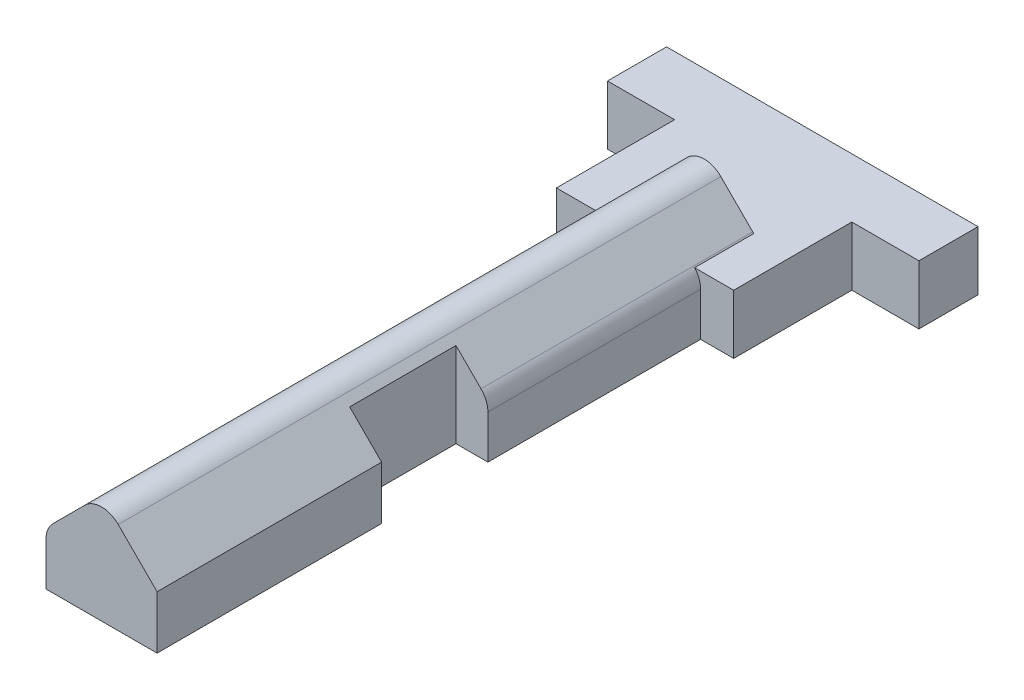
ISO-10303-21;
HEADER;
FILE_DESCRIPTION(('STEP AP214'),'2;1');
FILE_NAME('part.step','',(''),(''),'','','');
FILE_SCHEMA(('AUTOMOTIVE_DESIGN { 1 0 10303 214 1 1 1 1 }'));
ENDSEC;
DATA;
#1=APPLICATION_CONTEXT('core data for automotive mechanical design processes');
#2=APPLICATION_PROTOCOL_DEFINITION('international standard','automotive_design',2000,#1);
#3=PRODUCT_CONTEXT('',#1,'mechanical');
#4=PRODUCT('Part','Part','',(#3));
#5=PRODUCT_RELATED_PRODUCT_CATEGORY('part','',(#4));
#6=PRODUCT_DEFINITION_FORMATION('','',#4);
#7=PRODUCT_DEFINITION_CONTEXT('part definition',#1,'design');
#8=PRODUCT_DEFINITION('design','',#6,#7);
#9=PRODUCT_DEFINITION_SHAPE('','',#8);
#10=(LENGTH_UNIT() NAMED_UNIT(*) SI_UNIT(.MILLI.,.METRE.));
#11=(NAMED_UNIT(*) PLANE_ANGLE_UNIT() SI_UNIT($,.RADIAN.));
#12=(NAMED_UNIT(*) SI_UNIT($,.STERADIAN.) SOLID_ANGLE_UNIT());
#13=UNCERTAINTY_MEASURE_WITH_UNIT(LENGTH_MEASURE(1.E-05),#10,'distance_accuracy_value','');
#14=(GEOMETRIC_REPRESENTATION_CONTEXT(3) GLOBAL_UNCERTAINTY_ASSIGNED_CONTEXT((#13)) GLOBAL_UNIT_ASSIGNED_CONTEXT((#10,
#11,#12)) REPRESENTATION_CONTEXT('',''));
#15=CARTESIAN_POINT('',(0.,0.,0.));
#16=DIRECTION('',(0.,0.,1.));
#17=DIRECTION('',(1.,0.,0.));
#18=AXIS2_PLACEMENT_3D('',#15,#16,#17);
#19=CARTESIAN_POINT('',(0.,0.,0.));
#20=DIRECTION('',(0.,0.,1.));
#21=DIRECTION('',(1.,0.,0.));
#22=AXIS2_PLACEMENT_3D('',#19,#20,#21);
#23=PLANE('',#22);
#24=DIRECTION('',(0.707106781186546,-0.707106781186549,0.));
#25=VECTOR('',#24,1.);
#26=CARTESIAN_POINT('',(3.47500000000001,3.475,0.));
#27=LINE('',#26,#25);
#28=CARTESIAN_POINT('',(1.4142135623731,5.53578643762692,0.));
#29=VERTEX_POINT('',#28);
#30=CARTESIAN_POINT('',(4.1142135623731,2.83578643762691,0.));
#31=VERTEX_POINT('',#30);
#32=EDGE_CURVE('E331',#29,#31,#27,.T.);
#33=ORIENTED_EDGE('',*,*,#32,.T.);
#34=CARTESIAN_POINT('',(2.7,1.42157287525381,0.));
#35=DIRECTION('',(0.,0.,1.));
#36=DIRECTION('',(1.,0.,0.));
#37=AXIS2_PLACEMENT_3D('',#34,#35,#36);
#38=CIRCLE('',#37,2.);
#39=CARTESIAN_POINT('',(4.19508574143378,2.75,0.));
#40=VERTEX_POINT('',#39);
#41=EDGE_CURVE('E378',#31,#40,#38,.F.);
#42=ORIENTED_EDGE('',*,*,#41,.T.);
#43=DIRECTION('',(1.,0.,0.));
#44=VECTOR('',#43,1.);
#45=CARTESIAN_POINT('',(0.,2.75,0.));
#46=LINE('',#45,#44);
#47=CARTESIAN_POINT('',(-4.19508574143377,2.75,0.));
#48=VERTEX_POINT('',#47);
#49=EDGE_CURVE('E365',#48,#40,#46,.T.);
#50=ORIENTED_EDGE('',*,*,#49,.F.);
#51=CARTESIAN_POINT('',(-2.7,1.42157287525381,0.));
#52=DIRECTION('',(0.,0.,1.));
#53=DIRECTION('',(1.,0.,0.));
#54=AXIS2_PLACEMENT_3D('',#51,#52,#53);
#55=CIRCLE('',#54,2.);
#56=CARTESIAN_POINT('',(-4.1142135623731,2.83578643762691,0.));
#57=VERTEX_POINT('',#56);
#58=EDGE_CURVE('E376',#48,#57,#55,.F.);
#59=ORIENTED_EDGE('',*,*,#58,.T.);
#60=DIRECTION('',(0.707106781186546,0.707106781186549,0.));
#61=VECTOR('',#60,1.);
#62=CARTESIAN_POINT('',(-3.47500000000001,3.475,0.));
#63=LINE('',#62,#61);
#64=CARTESIAN_POINT('',(-1.4142135623731,5.53578643762692,0.));
#65=VERTEX_POINT('',#64);
#66=EDGE_CURVE('E335',#57,#65,#63,.T.);
#67=ORIENTED_EDGE('',*,*,#66,.T.);
#68=CARTESIAN_POINT('',(0.,4.12157287525382,0.));
#69=DIRECTION('',(0.,0.,1.));
#70=DIRECTION('',(1.,0.,0.));
#71=AXIS2_PLACEMENT_3D('',#68,#69,#70);
#72=CIRCLE('',#71,2.);
#73=EDGE_CURVE('E374',#65,#29,#72,.F.);
#74=ORIENTED_EDGE('',*,*,#73,.T.);
#75=EDGE_LOOP('',(#33,#42,#50,#59,#67,#74));
#76=FACE_BOUND('',#75,.T.);
#77=ADVANCED_FACE('F89',(#76),#23,.F.);
#78=CARTESIAN_POINT('',(3.47500000000001,3.475,51.));
#79=DIRECTION('',(0.707106781186549,0.707106781186546,0.));
#80=DIRECTION('',(-0.707106781186546,0.707106781186549,0.));
#81=AXIS2_PLACEMENT_3D('',#78,#79,#80);
#82=PLANE('',#81);
#83=DIRECTION('',(-0.707106781186546,0.707106781186549,0.));
#84=VECTOR('',#83,1.);
#85=CARTESIAN_POINT('',(3.47500000000001,3.475,23.));
#86=LINE('',#85,#84);
#87=CARTESIAN_POINT('',(4.1142135623731,2.83578643762691,23.));
#88=VERTEX_POINT('',#87);
#89=CARTESIAN_POINT('',(2.,4.95000000000001,23.));
#90=VERTEX_POINT('',#89);
#91=EDGE_CURVE('E323',#88,#90,#86,.T.);
#92=ORIENTED_EDGE('',*,*,#91,.F.);
#93=DIRECTION('',(0.,0.,-1.));
#94=VECTOR('',#93,1.);
#95=CARTESIAN_POINT('',(4.1142135623731,2.83578643762691,51.));
#96=LINE('',#95,#94);
#97=EDGE_CURVE('E371',#88,#31,#96,.T.);
#98=ORIENTED_EDGE('',*,*,#97,.T.);
#99=ORIENTED_EDGE('',*,*,#32,.F.);
#100=DIRECTION('',(0.,0.,-1.));
#101=VECTOR('',#100,1.);
#102=CARTESIAN_POINT('',(1.4142135623731,5.53578643762692,51.));
#103=LINE('',#102,#101);
#104=CARTESIAN_POINT('',(1.4142135623731,5.53578643762692,51.));
#105=VERTEX_POINT('',#104);
#106=EDGE_CURVE('E369',#29,#105,#103,.F.);
#107=ORIENTED_EDGE('',*,*,#106,.T.);
#108=DIRECTION('',(0.707106781186546,-0.707106781186549,0.));
#109=VECTOR('',#108,1.);
#110=CARTESIAN_POINT('',(3.47500000000001,3.475,51.));
#111=LINE('',#110,#109);
#112=CARTESIAN_POINT('',(4.7,2.25,51.));
#113=VERTEX_POINT('',#112);
#114=EDGE_CURVE('E332',#105,#113,#111,.T.);
#115=ORIENTED_EDGE('',*,*,#114,.T.);
#116=DIRECTION('',(0.,0.,-1.));
#117=VECTOR('',#116,1.);
#118=CARTESIAN_POINT('',(4.7,2.25,51.));
#119=LINE('',#118,#117);
#120=CARTESIAN_POINT('',(4.7,2.25,32.));
#121=VERTEX_POINT('',#120);
#122=EDGE_CURVE('E345',#113,#121,#119,.T.);
#123=ORIENTED_EDGE('',*,*,#122,.T.);
#124=DIRECTION('',(-0.707106781186546,0.707106781186549,0.));
#125=VECTOR('',#124,1.);
#126=CARTESIAN_POINT('',(3.47500000000001,3.475,32.));
#127=LINE('',#126,#125);
#128=CARTESIAN_POINT('',(2.,4.95000000000001,32.));
#129=VERTEX_POINT('',#128);
#130=EDGE_CURVE('E326',#121,#129,#127,.T.);
#131=ORIENTED_EDGE('',*,*,#130,.T.);
#132=DIRECTION('',(0.,0.,1.));
#133=VECTOR('',#132,1.);
#134=CARTESIAN_POINT('',(2.,4.95000000000001,51.));
#135=LINE('',#134,#133);
#136=EDGE_CURVE('E329',#90,#129,#135,.T.);
#137=ORIENTED_EDGE('',*,*,#136,.F.);
#138=EDGE_LOOP('',(#92,#98,#99,#107,#115,#123,#131,#137));
#139=FACE_BOUND('',#138,.T.);
#140=ADVANCED_FACE('F422',(#139),#82,.T.);
#141=CARTESIAN_POINT('',(0.,-2.25,51.));
#142=DIRECTION('',(0.,1.,0.));
#143=DIRECTION('',(-1.,0.,0.));
#144=AXIS2_PLACEMENT_3D('',#141,#142,#143);
#145=PLANE('',#144);
#146=DIRECTION('',(0.,0.,-1.));
#147=VECTOR('',#146,1.);
#148=CARTESIAN_POINT('',(-4.7,-2.25,51.));
#149=LINE('',#148,#147);
#150=CARTESIAN_POINT('',(-4.7,-2.25,51.));
#151=VERTEX_POINT('',#150);
#152=CARTESIAN_POINT('',(-4.7,-2.25,5.));
#153=VERTEX_POINT('',#152);
#154=EDGE_CURVE('E356',#151,#153,#149,.T.);
#155=ORIENTED_EDGE('',*,*,#154,.T.);
#156=DIRECTION('',(-1.,0.,0.));
#157=VECTOR('',#156,1.);
#158=CARTESIAN_POINT('',(0.,-2.25,5.));
#159=LINE('',#158,#157);
#160=CARTESIAN_POINT('',(-7.5,-2.25,5.));
#161=VERTEX_POINT('',#160);
#162=EDGE_CURVE('E290',#153,#161,#159,.T.);
#163=ORIENTED_EDGE('',*,*,#162,.T.);
#164=DIRECTION('',(0.,0.,1.));
#165=VECTOR('',#164,1.);
#166=CARTESIAN_POINT('',(-7.5,-2.25,0.));
#167=LINE('',#166,#165);
#168=CARTESIAN_POINT('',(-7.5,-2.25,-5.));
#169=VERTEX_POINT('',#168);
#170=EDGE_CURVE('E266',#169,#161,#167,.T.);
#171=ORIENTED_EDGE('',*,*,#170,.F.);
#172=DIRECTION('',(-1.,0.,0.));
#173=VECTOR('',#172,1.);
#174=CARTESIAN_POINT('',(0.,-2.25,-5.));
#175=LINE('',#174,#173);
#176=CARTESIAN_POINT('',(-13.1781166472828,-2.25,-5.));
#177=VERTEX_POINT('',#176);
#178=EDGE_CURVE('E263',#169,#177,#175,.T.);
#179=ORIENTED_EDGE('',*,*,#178,.T.);
#180=DIRECTION('',(0.,0.,1.));
#181=VECTOR('',#180,1.);
#182=CARTESIAN_POINT('',(-13.1781166472828,-2.25,0.));
#183=LINE('',#182,#181);
#184=CARTESIAN_POINT('',(-13.1781166472828,-2.25,-10.));
#185=VERTEX_POINT('',#184);
#186=EDGE_CURVE('E280',#185,#177,#183,.T.);
#187=ORIENTED_EDGE('',*,*,#186,.F.);
#188=DIRECTION('',(-1.,0.,0.));
#189=VECTOR('',#188,1.);
#190=CARTESIAN_POINT('',(0.,-2.25,-10.));
#191=LINE('',#190,#189);
#192=CARTESIAN_POINT('',(13.1781166472828,-2.25,-10.));
#193=VERTEX_POINT('',#192);
#194=EDGE_CURVE('E253',#193,#185,#191,.T.);
#195=ORIENTED_EDGE('',*,*,#194,.F.);
#196=DIRECTION('',(0.,0.,1.));
#197=VECTOR('',#196,1.);
#198=CARTESIAN_POINT('',(13.1781166472828,-2.25,0.));
#199=LINE('',#198,#197);
#200=CARTESIAN_POINT('',(13.1781166472828,-2.25,-5.));
#201=VERTEX_POINT('',#200);
#202=EDGE_CURVE('E283',#193,#201,#199,.T.);
#203=ORIENTED_EDGE('',*,*,#202,.T.);
#204=CARTESIAN_POINT('',(7.5,-2.25,-5.));
#205=VERTEX_POINT('',#204);
#206=EDGE_CURVE('E268',#201,#205,#175,.T.);
#207=ORIENTED_EDGE('',*,*,#206,.T.);
#208=DIRECTION('',(0.,0.,1.));
#209=VECTOR('',#208,1.);
#210=CARTESIAN_POINT('',(7.5,-2.25,0.));
#211=LINE('',#210,#209);
#212=CARTESIAN_POINT('',(7.5,-2.25,5.));
#213=VERTEX_POINT('',#212);
#214=EDGE_CURVE('E287',#205,#213,#211,.T.);
#215=ORIENTED_EDGE('',*,*,#214,.T.);
#216=CARTESIAN_POINT('',(4.7,-2.25,5.));
#217=VERTEX_POINT('',#216);
#218=EDGE_CURVE('E291',#213,#217,#159,.T.);
#219=ORIENTED_EDGE('',*,*,#218,.T.);
#220=DIRECTION('',(0.,0.,-1.));
#221=VECTOR('',#220,1.);
#222=CARTESIAN_POINT('',(4.7,-2.25,51.));
#223=LINE('',#222,#221);
#224=CARTESIAN_POINT('',(4.7,-2.25,23.));
#225=VERTEX_POINT('',#224);
#226=EDGE_CURVE('E352',#225,#217,#223,.T.);
#227=ORIENTED_EDGE('',*,*,#226,.F.);
#228=DIRECTION('',(1.,0.,0.));
#229=VECTOR('',#228,1.);
#230=CARTESIAN_POINT('',(0.,-2.25,23.));
#231=LINE('',#230,#229);
#232=CARTESIAN_POINT('',(2.,-2.25,23.));
#233=VERTEX_POINT('',#232);
#234=EDGE_CURVE('E318',#233,#225,#231,.T.);
#235=ORIENTED_EDGE('',*,*,#234,.F.);
#236=DIRECTION('',(0.,0.,-1.));
#237=VECTOR('',#236,1.);
#238=CARTESIAN_POINT('',(2.,-2.25,0.));
#239=LINE('',#238,#237);
#240=CARTESIAN_POINT('',(2.,-2.25,32.));
#241=VERTEX_POINT('',#240);
#242=EDGE_CURVE('E315',#241,#233,#239,.T.);
#243=ORIENTED_EDGE('',*,*,#242,.F.);
#244=DIRECTION('',(1.,0.,0.));
#245=VECTOR('',#244,1.);
#246=CARTESIAN_POINT('',(0.,-2.25,32.));
#247=LINE('',#246,#245);
#248=CARTESIAN_POINT('',(4.7,-2.25,32.));
#249=VERTEX_POINT('',#248);
#250=EDGE_CURVE('E312',#241,#249,#247,.T.);
#251=ORIENTED_EDGE('',*,*,#250,.T.);
#252=CARTESIAN_POINT('',(4.7,-2.25,51.));
#253=VERTEX_POINT('',#252);
#254=EDGE_CURVE('E353',#253,#249,#223,.T.);
#255=ORIENTED_EDGE('',*,*,#254,.F.);
#256=DIRECTION('',(1.,0.,0.));
#257=VECTOR('',#256,1.);
#258=CARTESIAN_POINT('',(0.,-2.25,51.));
#259=LINE('',#258,#257);
#260=EDGE_CURVE('E340',#151,#253,#259,.T.);
#261=ORIENTED_EDGE('',*,*,#260,.F.);
#262=EDGE_LOOP('',(#155,#163,#171,#179,#187,#195,#203,#207,#215,#219,#227,#235,#243,#251,#255,#261));
#263=FACE_BOUND('',#262,.T.);
#264=ADVANCED_FACE('F436',(#263),#145,.F.);
#265=CARTESIAN_POINT('',(4.7,0.,51.));
#266=DIRECTION('',(1.,0.,0.));
#267=DIRECTION('',(0.,0.,-1.));
#268=AXIS2_PLACEMENT_3D('',#265,#266,#267);
#269=PLANE('',#268);
#270=ORIENTED_EDGE('',*,*,#254,.T.);
#271=DIRECTION('',(0.,1.,0.));
#272=VECTOR('',#271,1.);
#273=CARTESIAN_POINT('',(4.7,0.,32.));
#274=LINE('',#273,#272);
#275=EDGE_CURVE('E362',#249,#121,#274,.T.);
#276=ORIENTED_EDGE('',*,*,#275,.T.);
#277=ORIENTED_EDGE('',*,*,#122,.F.);
#278=DIRECTION('',(0.,-1.,0.));
#279=VECTOR('',#278,1.);
#280=CARTESIAN_POINT('',(4.7,0.,51.));
#281=LINE('',#280,#279);
#282=EDGE_CURVE('E342',#113,#253,#281,.T.);
#283=ORIENTED_EDGE('',*,*,#282,.T.);
#284=EDGE_LOOP('',(#270,#276,#277,#283));
#285=FACE_BOUND('',#284,.T.);
#286=ADVANCED_FACE('F480',(#285),#269,.T.);
#287=CARTESIAN_POINT('',(-3.47500000000001,3.475,51.));
#288=DIRECTION('',(-0.707106781186549,0.707106781186546,0.));
#289=DIRECTION('',(-0.707106781186546,-0.707106781186549,0.));
#290=AXIS2_PLACEMENT_3D('',#287,#288,#289);
#291=PLANE('',#290);
#292=ORIENTED_EDGE('',*,*,#66,.F.);
#293=DIRECTION('',(0.,0.,-1.));
#294=VECTOR('',#293,1.);
#295=CARTESIAN_POINT('',(-4.1142135623731,2.83578643762691,51.));
#296=LINE('',#295,#294);
#297=CARTESIAN_POINT('',(-4.1142135623731,2.83578643762691,51.));
#298=VERTEX_POINT('',#297);
#299=EDGE_CURVE('E390',#57,#298,#296,.F.);
#300=ORIENTED_EDGE('',*,*,#299,.T.);
#301=DIRECTION('',(0.707106781186546,0.707106781186549,0.));
#302=VECTOR('',#301,1.);
#303=CARTESIAN_POINT('',(-3.47500000000001,3.475,51.));
#304=LINE('',#303,#302);
#305=CARTESIAN_POINT('',(-1.4142135623731,5.53578643762692,51.));
#306=VERTEX_POINT('',#305);
#307=EDGE_CURVE('E334',#298,#306,#304,.T.);
#308=ORIENTED_EDGE('',*,*,#307,.T.);
#309=DIRECTION('',(0.,0.,-1.));
#310=VECTOR('',#309,1.);
#311=CARTESIAN_POINT('',(-1.4142135623731,5.53578643762692,51.));
#312=LINE('',#311,#310);
#313=EDGE_CURVE('E387',#306,#65,#312,.T.);
#314=ORIENTED_EDGE('',*,*,#313,.T.);
#315=EDGE_LOOP('',(#292,#300,#308,#314));
#316=FACE_BOUND('',#315,.T.);
#317=ADVANCED_FACE('F475',(#316),#291,.T.);
#318=CARTESIAN_POINT('',(-4.7,0.,51.));
#319=DIRECTION('',(1.,0.,0.));
#320=DIRECTION('',(0.,0.,-1.));
#321=AXIS2_PLACEMENT_3D('',#318,#319,#320);
#322=PLANE('',#321);
#323=DIRECTION('',(0.,-1.,0.));
#324=VECTOR('',#323,1.);
#325=CARTESIAN_POINT('',(-4.7,0.,51.));
#326=LINE('',#325,#324);
#327=CARTESIAN_POINT('',(-4.7,1.42157287525381,51.));
#328=VERTEX_POINT('',#327);
#329=EDGE_CURVE('E338',#328,#151,#326,.T.);
#330=ORIENTED_EDGE('',*,*,#329,.F.);
#331=DIRECTION('',(0.,0.,-1.));
#332=VECTOR('',#331,1.);
#333=CARTESIAN_POINT('',(-4.7,1.42157287525381,5.));
#334=LINE('',#333,#332);
#335=CARTESIAN_POINT('',(-4.7,1.42157287525381,5.));
#336=VERTEX_POINT('',#335);
#337=EDGE_CURVE('E384',#328,#336,#334,.T.);
#338=ORIENTED_EDGE('',*,*,#337,.T.);
#339=DIRECTION('',(0.,-1.,0.));
#340=VECTOR('',#339,1.);
#341=CARTESIAN_POINT('',(-4.7,0.,5.));
#342=LINE('',#341,#340);
#343=EDGE_CURVE('E297',#336,#153,#342,.T.);
#344=ORIENTED_EDGE('',*,*,#343,.T.);
#345=ORIENTED_EDGE('',*,*,#154,.F.);
#346=EDGE_LOOP('',(#330,#338,#344,#345));
#347=FACE_BOUND('',#346,.T.);
#348=ADVANCED_FACE('F467',(#347),#322,.F.);
#349=DIRECTION('',(0.,-1.,0.));
#350=VECTOR('',#349,1.);
#351=CARTESIAN_POINT('',(4.7,0.,5.));
#352=LINE('',#351,#350);
#353=CARTESIAN_POINT('',(4.7,1.42157287525381,5.));
#354=VERTEX_POINT('',#353);
#355=EDGE_CURVE('E367',#354,#217,#352,.T.);
#356=ORIENTED_EDGE('',*,*,#355,.F.);
#357=DIRECTION('',(0.,0.,-1.));
#358=VECTOR('',#357,1.);
#359=CARTESIAN_POINT('',(4.7,1.42157287525381,51.));
#360=LINE('',#359,#358);
#361=CARTESIAN_POINT('',(4.7,1.42157287525381,23.));
#362=VERTEX_POINT('',#361);
#363=EDGE_CURVE('E380',#354,#362,#360,.F.);
#364=ORIENTED_EDGE('',*,*,#363,.T.);
#365=DIRECTION('',(0.,1.,0.));
#366=VECTOR('',#365,1.);
#367=CARTESIAN_POINT('',(4.7,0.,23.));
#368=LINE('',#367,#366);
#369=EDGE_CURVE('E359',#225,#362,#368,.T.);
#370=ORIENTED_EDGE('',*,*,#369,.F.);
#371=ORIENTED_EDGE('',*,*,#226,.T.);
#372=EDGE_LOOP('',(#356,#364,#370,#371));
#373=FACE_BOUND('',#372,.T.);
#374=ADVANCED_FACE('F441',(#373),#269,.T.);
#375=CARTESIAN_POINT('',(0.,0.,51.));
#376=DIRECTION('',(0.,0.,1.));
#377=DIRECTION('',(1.,0.,0.));
#378=AXIS2_PLACEMENT_3D('',#375,#376,#377);
#379=PLANE('',#378);
#380=ORIENTED_EDGE('',*,*,#307,.F.);
#381=CARTESIAN_POINT('',(-2.7,1.42157287525381,51.));
#382=DIRECTION('',(0.,0.,1.));
#383=DIRECTION('',(1.,0.,0.));
#384=AXIS2_PLACEMENT_3D('',#381,#382,#383);
#385=CIRCLE('',#384,2.);
#386=EDGE_CURVE('E394',#298,#328,#385,.T.);
#387=ORIENTED_EDGE('',*,*,#386,.T.);
#388=ORIENTED_EDGE('',*,*,#329,.T.);
#389=ORIENTED_EDGE('',*,*,#260,.T.);
#390=ORIENTED_EDGE('',*,*,#282,.F.);
#391=ORIENTED_EDGE('',*,*,#114,.F.);
#392=CARTESIAN_POINT('',(0.,4.12157287525382,51.));
#393=DIRECTION('',(0.,0.,1.));
#394=DIRECTION('',(1.,0.,0.));
#395=AXIS2_PLACEMENT_3D('',#392,#393,#394);
#396=CIRCLE('',#395,2.);
#397=EDGE_CURVE('E392',#105,#306,#396,.T.);
#398=ORIENTED_EDGE('',*,*,#397,.T.);
#399=EDGE_LOOP('',(#380,#387,#388,#389,#390,#391,#398));
#400=FACE_BOUND('',#399,.T.);
#401=ADVANCED_FACE('F470',(#400),#379,.T.);
#402=CARTESIAN_POINT('',(0.,7.75,32.));
#403=DIRECTION('',(0.,0.,-1.));
#404=DIRECTION('',(-1.,0.,0.));
#405=AXIS2_PLACEMENT_3D('',#402,#403,#404);
#406=PLANE('',#405);
#407=ORIENTED_EDGE('',*,*,#275,.F.);
#408=ORIENTED_EDGE('',*,*,#250,.F.);
#409=DIRECTION('',(0.,-1.,0.));
#410=VECTOR('',#409,1.);
#411=CARTESIAN_POINT('',(2.,7.75,32.));
#412=LINE('',#411,#410);
#413=EDGE_CURVE('E320',#129,#241,#412,.T.);
#414=ORIENTED_EDGE('',*,*,#413,.F.);
#415=ORIENTED_EDGE('',*,*,#130,.F.);
#416=EDGE_LOOP('',(#407,#408,#414,#415));
#417=FACE_BOUND('',#416,.T.);
#418=ADVANCED_FACE('F482',(#417),#406,.T.);
#419=CARTESIAN_POINT('',(0.,7.75,23.));
#420=DIRECTION('',(0.,0.,-1.));
#421=DIRECTION('',(-1.,0.,0.));
#422=AXIS2_PLACEMENT_3D('',#419,#420,#421);
#423=PLANE('',#422);
#424=ORIENTED_EDGE('',*,*,#369,.T.);
#425=CARTESIAN_POINT('',(2.7,1.42157287525381,23.));
#426=DIRECTION('',(0.,0.,-1.));
#427=DIRECTION('',(-1.,0.,0.));
#428=AXIS2_PLACEMENT_3D('',#425,#426,#427);
#429=CIRCLE('',#428,2.);
#430=EDGE_CURVE('E382',#362,#88,#429,.F.);
#431=ORIENTED_EDGE('',*,*,#430,.T.);
#432=ORIENTED_EDGE('',*,*,#91,.T.);
#433=DIRECTION('',(0.,-1.,0.));
#434=VECTOR('',#433,1.);
#435=CARTESIAN_POINT('',(2.,7.75,23.));
#436=LINE('',#435,#434);
#437=EDGE_CURVE('E321',#90,#233,#436,.T.);
#438=ORIENTED_EDGE('',*,*,#437,.T.);
#439=ORIENTED_EDGE('',*,*,#234,.T.);
#440=EDGE_LOOP('',(#424,#431,#432,#438,#439));
#441=FACE_BOUND('',#440,.T.);
#442=ADVANCED_FACE('F427',(#441),#423,.F.);
#443=CARTESIAN_POINT('',(2.,7.75,0.));
#444=DIRECTION('',(-1.,0.,0.));
#445=DIRECTION('',(0.,0.,1.));
#446=AXIS2_PLACEMENT_3D('',#443,#444,#445);
#447=PLANE('',#446);
#448=ORIENTED_EDGE('',*,*,#136,.T.);
#449=ORIENTED_EDGE('',*,*,#413,.T.);
#450=ORIENTED_EDGE('',*,*,#242,.T.);
#451=ORIENTED_EDGE('',*,*,#437,.F.);
#452=EDGE_LOOP('',(#448,#449,#450,#451));
#453=FACE_BOUND('',#452,.T.);
#454=ADVANCED_FACE('F429',(#453),#447,.F.);
#455=CARTESIAN_POINT('',(0.,2.75,5.));
#456=DIRECTION('',(0.,0.,1.));
#457=DIRECTION('',(1.,0.,0.));
#458=AXIS2_PLACEMENT_3D('',#455,#456,#457);
#459=PLANE('',#458);
#460=ORIENTED_EDGE('',*,*,#343,.F.);
#461=CARTESIAN_POINT('',(-2.7,1.42157287525381,5.));
#462=DIRECTION('',(0.,0.,1.));
#463=DIRECTION('',(1.,0.,0.));
#464=AXIS2_PLACEMENT_3D('',#461,#462,#463);
#465=CIRCLE('',#464,2.);
#466=CARTESIAN_POINT('',(-4.19508574143378,2.75,5.));
#467=VERTEX_POINT('',#466);
#468=EDGE_CURVE('E97',#336,#467,#465,.F.);
#469=ORIENTED_EDGE('',*,*,#468,.T.);
#470=DIRECTION('',(-1.,0.,0.));
#471=VECTOR('',#470,1.);
#472=CARTESIAN_POINT('',(0.,2.75,5.));
#473=LINE('',#472,#471);
#474=CARTESIAN_POINT('',(-7.5,2.75,5.));
#475=VERTEX_POINT('',#474);
#476=EDGE_CURVE('E103',#467,#475,#473,.T.);
#477=ORIENTED_EDGE('',*,*,#476,.T.);
#478=DIRECTION('',(0.,-1.,0.));
#479=VECTOR('',#478,1.);
#480=CARTESIAN_POINT('',(-7.5,2.75,5.));
#481=LINE('',#480,#479);
#482=EDGE_CURVE('E300',#475,#161,#481,.T.);
#483=ORIENTED_EDGE('',*,*,#482,.T.);
#484=ORIENTED_EDGE('',*,*,#162,.F.);
#485=EDGE_LOOP('',(#460,#469,#477,#483,#484));
#486=FACE_BOUND('',#485,.T.);
#487=ADVANCED_FACE('F402',(#486),#459,.T.);
#488=CARTESIAN_POINT('',(-7.5,2.75,0.));
#489=DIRECTION('',(1.,0.,0.));
#490=DIRECTION('',(0.,1.,0.));
#491=AXIS2_PLACEMENT_3D('',#488,#489,#490);
#492=PLANE('',#491);
#493=ORIENTED_EDGE('',*,*,#170,.T.);
#494=ORIENTED_EDGE('',*,*,#482,.F.);
#495=DIRECTION('',(0.,0.,1.));
#496=VECTOR('',#495,1.);
#497=CARTESIAN_POINT('',(-7.5,2.75,0.));
#498=LINE('',#497,#496);
#499=CARTESIAN_POINT('',(-7.5,2.75,-5.));
#500=VERTEX_POINT('',#499);
#501=EDGE_CURVE('E278',#500,#475,#498,.T.);
#502=ORIENTED_EDGE('',*,*,#501,.F.);
#503=DIRECTION('',(0.,-1.,0.));
#504=VECTOR('',#503,1.);
#505=CARTESIAN_POINT('',(-7.5,2.75,-5.));
#506=LINE('',#505,#504);
#507=EDGE_CURVE('E298',#500,#169,#506,.T.);
#508=ORIENTED_EDGE('',*,*,#507,.T.);
#509=EDGE_LOOP('',(#493,#494,#502,#508));
#510=FACE_BOUND('',#509,.T.);
#511=ADVANCED_FACE('F461',(#510),#492,.F.);
#512=CARTESIAN_POINT('',(7.5,2.75,0.));
#513=DIRECTION('',(1.,0.,0.));
#514=DIRECTION('',(0.,1.,0.));
#515=AXIS2_PLACEMENT_3D('',#512,#513,#514);
#516=PLANE('',#515);
#517=ORIENTED_EDGE('',*,*,#214,.F.);
#518=DIRECTION('',(0.,-1.,0.));
#519=VECTOR('',#518,1.);
#520=CARTESIAN_POINT('',(7.5,2.75,-5.));
#521=LINE('',#520,#519);
#522=CARTESIAN_POINT('',(7.5,2.75,-5.));
#523=VERTEX_POINT('',#522);
#524=EDGE_CURVE('E306',#523,#205,#521,.T.);
#525=ORIENTED_EDGE('',*,*,#524,.F.);
#526=DIRECTION('',(0.,0.,1.));
#527=VECTOR('',#526,1.);
#528=CARTESIAN_POINT('',(7.5,2.75,0.));
#529=LINE('',#528,#527);
#530=CARTESIAN_POINT('',(7.5,2.75,5.));
#531=VERTEX_POINT('',#530);
#532=EDGE_CURVE('E274',#523,#531,#529,.T.);
#533=ORIENTED_EDGE('',*,*,#532,.T.);
#534=DIRECTION('',(0.,-1.,0.));
#535=VECTOR('',#534,1.);
#536=CARTESIAN_POINT('',(7.5,2.75,5.));
#537=LINE('',#536,#535);
#538=EDGE_CURVE('E303',#531,#213,#537,.T.);
#539=ORIENTED_EDGE('',*,*,#538,.T.);
#540=EDGE_LOOP('',(#517,#525,#533,#539));
#541=FACE_BOUND('',#540,.T.);
#542=ADVANCED_FACE('F446',(#541),#516,.T.);
#543=CARTESIAN_POINT('',(4.19508574143378,2.75,5.));
#544=VERTEX_POINT('',#543);
#545=EDGE_CURVE('E111',#531,#544,#473,.T.);
#546=ORIENTED_EDGE('',*,*,#545,.T.);
#547=CARTESIAN_POINT('',(2.7,1.42157287525381,5.));
#548=DIRECTION('',(0.,0.,1.));
#549=DIRECTION('',(1.,0.,0.));
#550=AXIS2_PLACEMENT_3D('',#547,#548,#549);
#551=CIRCLE('',#550,2.);
#552=EDGE_CURVE('E398',#544,#354,#551,.F.);
#553=ORIENTED_EDGE('',*,*,#552,.T.);
#554=ORIENTED_EDGE('',*,*,#355,.T.);
#555=ORIENTED_EDGE('',*,*,#218,.F.);
#556=ORIENTED_EDGE('',*,*,#538,.F.);
#557=EDGE_LOOP('',(#546,#553,#554,#555,#556));
#558=FACE_BOUND('',#557,.T.);
#559=ADVANCED_FACE('F443',(#558),#459,.T.);
#560=CARTESIAN_POINT('',(0.,2.75,0.));
#561=DIRECTION('',(0.,-1.,0.));
#562=DIRECTION('',(1.,0.,0.));
#563=AXIS2_PLACEMENT_3D('',#560,#561,#562);
#564=PLANE('',#563);
#565=ORIENTED_EDGE('',*,*,#49,.T.);
#566=DIRECTION('',(0.,0.,-1.));
#567=VECTOR('',#566,1.);
#568=CARTESIAN_POINT('',(4.19508574143378,2.75,0.));
#569=LINE('',#568,#567);
#570=EDGE_CURVE('E396',#40,#544,#569,.F.);
#571=ORIENTED_EDGE('',*,*,#570,.T.);
#572=ORIENTED_EDGE('',*,*,#545,.F.);
#573=ORIENTED_EDGE('',*,*,#532,.F.);
#574=DIRECTION('',(-1.,0.,0.));
#575=VECTOR('',#574,1.);
#576=CARTESIAN_POINT('',(0.,2.75,-5.));
#577=LINE('',#576,#575);
#578=CARTESIAN_POINT('',(13.1781166472828,2.75,-5.));
#579=VERTEX_POINT('',#578);
#580=EDGE_CURVE('E271',#579,#523,#577,.T.);
#581=ORIENTED_EDGE('',*,*,#580,.F.);
#582=DIRECTION('',(0.,0.,1.));
#583=VECTOR('',#582,1.);
#584=CARTESIAN_POINT('',(13.1781166472828,2.75,0.));
#585=LINE('',#584,#583);
#586=CARTESIAN_POINT('',(13.1781166472828,2.75,-10.));
#587=VERTEX_POINT('',#586);
#588=EDGE_CURVE('E246',#587,#579,#585,.T.);
#589=ORIENTED_EDGE('',*,*,#588,.F.);
#590=DIRECTION('',(-1.,0.,0.));
#591=VECTOR('',#590,1.);
#592=CARTESIAN_POINT('',(0.,2.75,-10.));
#593=LINE('',#592,#591);
#594=CARTESIAN_POINT('',(-13.1781166472828,2.75,-10.));
#595=VERTEX_POINT('',#594);
#596=EDGE_CURVE('E236',#587,#595,#593,.T.);
#597=ORIENTED_EDGE('',*,*,#596,.T.);
#598=DIRECTION('',(0.,0.,1.));
#599=VECTOR('',#598,1.);
#600=CARTESIAN_POINT('',(-13.1781166472828,2.75,0.));
#601=LINE('',#600,#599);
#602=CARTESIAN_POINT('',(-13.1781166472828,2.75,-5.));
#603=VERTEX_POINT('',#602);
#604=EDGE_CURVE('E242',#595,#603,#601,.T.);
#605=ORIENTED_EDGE('',*,*,#604,.T.);
#606=EDGE_CURVE('E258',#500,#603,#577,.T.);
#607=ORIENTED_EDGE('',*,*,#606,.F.);
#608=ORIENTED_EDGE('',*,*,#501,.T.);
#609=ORIENTED_EDGE('',*,*,#476,.F.);
#610=DIRECTION('',(0.,0.,1.));
#611=VECTOR('',#610,1.);
#612=CARTESIAN_POINT('',(-4.19508574143378,2.75,5.));
#613=LINE('',#612,#611);
#614=EDGE_CURVE('E12',#467,#48,#613,.F.);
#615=ORIENTED_EDGE('',*,*,#614,.T.);
#616=EDGE_LOOP('',(#565,#571,#572,#573,#581,#589,#597,#605,#607,#608,#609,#615));
#617=FACE_BOUND('',#616,.T.);
#618=ADVANCED_FACE('F239',(#617),#564,.F.);
#619=CARTESIAN_POINT('',(13.1781166472828,2.75,0.));
#620=DIRECTION('',(1.,0.,0.));
#621=DIRECTION('',(0.,1.,0.));
#622=AXIS2_PLACEMENT_3D('',#619,#620,#621);
#623=PLANE('',#622);
#624=ORIENTED_EDGE('',*,*,#202,.F.);
#625=DIRECTION('',(0.,-1.,0.));
#626=VECTOR('',#625,1.);
#627=CARTESIAN_POINT('',(13.1781166472828,2.75,-10.));
#628=LINE('',#627,#626);
#629=EDGE_CURVE('E257',#587,#193,#628,.T.);
#630=ORIENTED_EDGE('',*,*,#629,.F.);
#631=ORIENTED_EDGE('',*,*,#588,.T.);
#632=DIRECTION('',(0.,-1.,0.));
#633=VECTOR('',#632,1.);
#634=CARTESIAN_POINT('',(13.1781166472828,2.75,-5.));
#635=LINE('',#634,#633);
#636=EDGE_CURVE('E308',#579,#201,#635,.T.);
#637=ORIENTED_EDGE('',*,*,#636,.T.);
#638=EDGE_LOOP('',(#624,#630,#631,#637));
#639=FACE_BOUND('',#638,.T.);
#640=ADVANCED_FACE('F453',(#639),#623,.T.);
#641=CARTESIAN_POINT('',(0.,2.75,-10.));
#642=DIRECTION('',(0.,0.,1.));
#643=DIRECTION('',(1.,0.,0.));
#644=AXIS2_PLACEMENT_3D('',#641,#642,#643);
#645=PLANE('',#644);
#646=ORIENTED_EDGE('',*,*,#194,.T.);
#647=DIRECTION('',(0.,-1.,0.));
#648=VECTOR('',#647,1.);
#649=CARTESIAN_POINT('',(-13.1781166472828,2.75,-10.));
#650=LINE('',#649,#648);
#651=EDGE_CURVE('E250',#595,#185,#650,.T.);
#652=ORIENTED_EDGE('',*,*,#651,.F.);
#653=ORIENTED_EDGE('',*,*,#596,.F.);
#654=ORIENTED_EDGE('',*,*,#629,.T.);
#655=EDGE_LOOP('',(#646,#652,#653,#654));
#656=FACE_BOUND('',#655,.T.);
#657=ADVANCED_FACE('F251',(#656),#645,.F.);
#658=CARTESIAN_POINT('',(-13.1781166472828,2.75,0.));
#659=DIRECTION('',(1.,0.,0.));
#660=DIRECTION('',(0.,0.,-1.));
#661=AXIS2_PLACEMENT_3D('',#658,#659,#660);
#662=PLANE('',#661);
#663=ORIENTED_EDGE('',*,*,#186,.T.);
#664=DIRECTION('',(0.,-1.,0.));
#665=VECTOR('',#664,1.);
#666=CARTESIAN_POINT('',(-13.1781166472828,2.75,-5.));
#667=LINE('',#666,#665);
#668=EDGE_CURVE('E261',#603,#177,#667,.T.);
#669=ORIENTED_EDGE('',*,*,#668,.F.);
#670=ORIENTED_EDGE('',*,*,#604,.F.);
#671=ORIENTED_EDGE('',*,*,#651,.T.);
#672=EDGE_LOOP('',(#663,#669,#670,#671));
#673=FACE_BOUND('',#672,.T.);
#674=ADVANCED_FACE('F260',(#673),#662,.F.);
#675=CARTESIAN_POINT('',(0.,2.75,-5.));
#676=DIRECTION('',(0.,0.,1.));
#677=DIRECTION('',(1.,0.,0.));
#678=AXIS2_PLACEMENT_3D('',#675,#676,#677);
#679=PLANE('',#678);
#680=ORIENTED_EDGE('',*,*,#178,.F.);
#681=ORIENTED_EDGE('',*,*,#507,.F.);
#682=ORIENTED_EDGE('',*,*,#606,.T.);
#683=ORIENTED_EDGE('',*,*,#668,.T.);
#684=EDGE_LOOP('',(#680,#681,#682,#683));
#685=FACE_BOUND('',#684,.T.);
#686=ADVANCED_FACE('F457',(#685),#679,.T.);
#687=ORIENTED_EDGE('',*,*,#206,.F.);
#688=ORIENTED_EDGE('',*,*,#636,.F.);
#689=ORIENTED_EDGE('',*,*,#580,.T.);
#690=ORIENTED_EDGE('',*,*,#524,.T.);
#691=EDGE_LOOP('',(#687,#688,#689,#690));
#692=FACE_BOUND('',#691,.T.);
#693=ADVANCED_FACE('F451',(#692),#679,.T.);
#694=CARTESIAN_POINT('',(2.7,1.42157287525381,51.));
#695=DIRECTION('',(0.,0.,-1.));
#696=DIRECTION('',(-1.,0.,0.));
#697=AXIS2_PLACEMENT_3D('',#694,#695,#696);
#698=CYLINDRICAL_SURFACE('',#697,2.);
#699=ORIENTED_EDGE('',*,*,#430,.F.);
#700=ORIENTED_EDGE('',*,*,#363,.F.);
#701=ORIENTED_EDGE('',*,*,#552,.F.);
#702=ORIENTED_EDGE('',*,*,#570,.F.);
#703=ORIENTED_EDGE('',*,*,#41,.F.);
#704=ORIENTED_EDGE('',*,*,#97,.F.);
#705=EDGE_LOOP('',(#699,#700,#701,#702,#703,#704));
#706=FACE_BOUND('',#705,.T.);
#707=ADVANCED_FACE('F418',(#706),#698,.T.);
#708=CARTESIAN_POINT('',(-2.7,1.42157287525381,51.));
#709=DIRECTION('',(0.,0.,1.));
#710=DIRECTION('',(1.,0.,0.));
#711=AXIS2_PLACEMENT_3D('',#708,#709,#710);
#712=CYLINDRICAL_SURFACE('',#711,2.);
#713=ORIENTED_EDGE('',*,*,#386,.F.);
#714=ORIENTED_EDGE('',*,*,#299,.F.);
#715=ORIENTED_EDGE('',*,*,#58,.F.);
#716=ORIENTED_EDGE('',*,*,#614,.F.);
#717=ORIENTED_EDGE('',*,*,#468,.F.);
#718=ORIENTED_EDGE('',*,*,#337,.F.);
#719=EDGE_LOOP('',(#713,#714,#715,#716,#717,#718));
#720=FACE_BOUND('',#719,.T.);
#721=ADVANCED_FACE('F408',(#720),#712,.T.);
#722=CARTESIAN_POINT('',(0.,4.12157287525382,51.));
#723=DIRECTION('',(0.,0.,-1.));
#724=DIRECTION('',(-1.,0.,0.));
#725=AXIS2_PLACEMENT_3D('',#722,#723,#724);
#726=CYLINDRICAL_SURFACE('',#725,2.);
#727=ORIENTED_EDGE('',*,*,#397,.F.);
#728=ORIENTED_EDGE('',*,*,#106,.F.);
#729=ORIENTED_EDGE('',*,*,#73,.F.);
#730=ORIENTED_EDGE('',*,*,#313,.F.);
#731=EDGE_LOOP('',(#727,#728,#729,#730));
#732=FACE_BOUND('',#731,.T.);
#733=ADVANCED_FACE('F91',(#732),#726,.T.);
#734=CLOSED_SHELL('',(#77,#140,#264,#286,#317,#348,#374,#401,#418,#442,#454,#487,#511,#542,#559,
#618,#640,#657,#674,#686,#693,#707,#721,#733));
#735=MANIFOLD_SOLID_BREP('B2',#734);
#736=ADVANCED_BREP_SHAPE_REPRESENTATION('',(#18,#735),#14);
#737=SHAPE_DEFINITION_REPRESENTATION(#9,#736);
ENDSEC;
END-ISO-10303-21;
